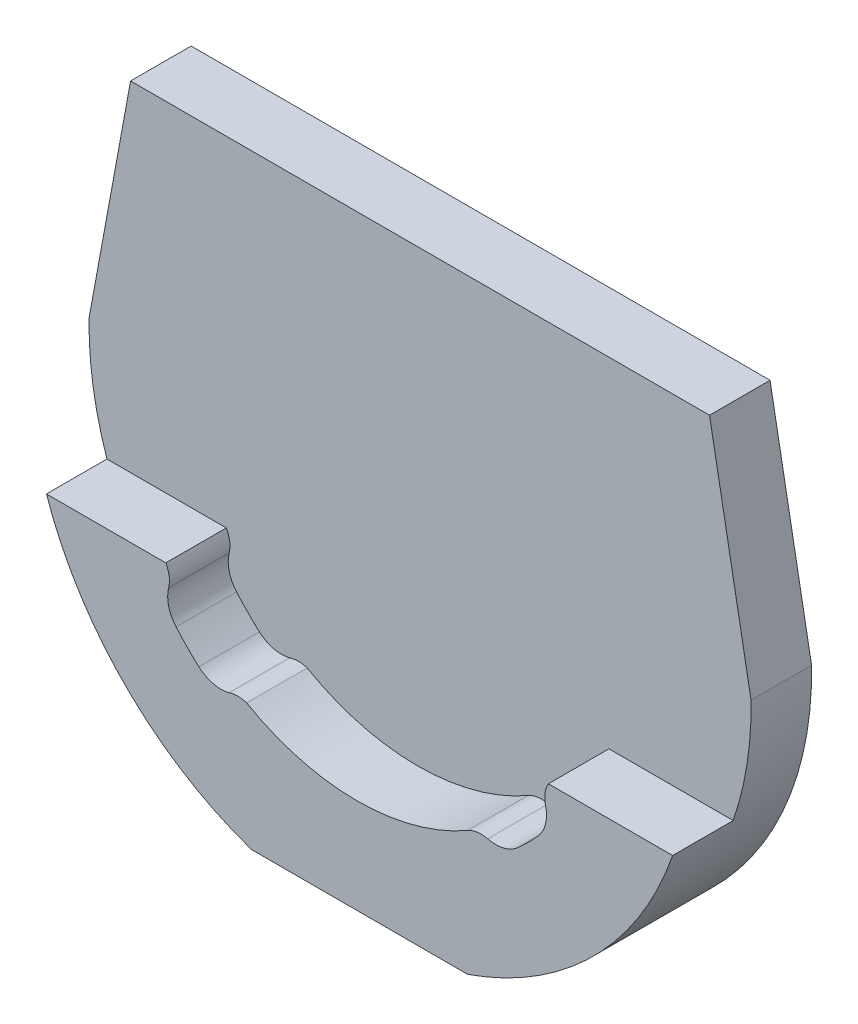
ISO-10303-21;
HEADER;
FILE_DESCRIPTION(('STEP AP214'),'2;1');
FILE_NAME('part.step','',(''),(''),'','','');
FILE_SCHEMA(('AUTOMOTIVE_DESIGN { 1 0 10303 214 1 1 1 1 }'));
ENDSEC;
DATA;
#1=APPLICATION_CONTEXT('core data for automotive mechanical design processes');
#2=APPLICATION_PROTOCOL_DEFINITION('international standard','automotive_design',2000,#1);
#3=PRODUCT_CONTEXT('',#1,'mechanical');
#4=PRODUCT('Part','Part','',(#3));
#5=PRODUCT_RELATED_PRODUCT_CATEGORY('part','',(#4));
#6=PRODUCT_DEFINITION_FORMATION('','',#4);
#7=PRODUCT_DEFINITION_CONTEXT('part definition',#1,'design');
#8=PRODUCT_DEFINITION('design','',#6,#7);
#9=PRODUCT_DEFINITION_SHAPE('','',#8);
#10=(LENGTH_UNIT() NAMED_UNIT(*) SI_UNIT(.MILLI.,.METRE.));
#11=(NAMED_UNIT(*) PLANE_ANGLE_UNIT() SI_UNIT($,.RADIAN.));
#12=(NAMED_UNIT(*) SI_UNIT($,.STERADIAN.) SOLID_ANGLE_UNIT());
#13=UNCERTAINTY_MEASURE_WITH_UNIT(LENGTH_MEASURE(1.E-05),#10,'distance_accuracy_value','');
#14=(GEOMETRIC_REPRESENTATION_CONTEXT(3) GLOBAL_UNCERTAINTY_ASSIGNED_CONTEXT((#13)) GLOBAL_UNIT_ASSIGNED_CONTEXT((#10,
#11,#12)) REPRESENTATION_CONTEXT('',''));
#15=CARTESIAN_POINT('',(0.,0.,0.));
#16=DIRECTION('',(0.,0.,1.));
#17=DIRECTION('',(1.,0.,0.));
#18=AXIS2_PLACEMENT_3D('',#15,#16,#17);
#19=CARTESIAN_POINT('',(0.,0.,10.));
#20=DIRECTION('',(0.,0.,1.));
#21=DIRECTION('',(1.,0.,0.));
#22=AXIS2_PLACEMENT_3D('',#19,#20,#21);
#23=PLANE('',#22);
#24=CARTESIAN_POINT('',(35.5296275291424,-74.0020685087198,10.));
#25=DIRECTION('',(0.,0.,1.));
#26=DIRECTION('',(1.,0.,0.));
#27=AXIS2_PLACEMENT_3D('',#24,#25,#26);
#28=CIRCLE('',#27,4.4999999999999);
#29=CARTESIAN_POINT('',(31.6325132121125,-71.7520685087199,10.));
#30=VERTEX_POINT('',#29);
#31=CARTESIAN_POINT('',(31.1615971727164,-75.0838775516383,10.));
#32=VERTEX_POINT('',#31);
#33=EDGE_CURVE('E63',#30,#32,#28,.T.);
#34=ORIENTED_EDGE('',*,*,#33,.F.);
#35=DIRECTION('',(1.,0.,0.));
#36=VECTOR('',#35,1.);
#37=CARTESIAN_POINT('',(0.,-71.7520685087199,10.));
#38=LINE('',#37,#36);
#39=CARTESIAN_POINT('',(52.1647802977796,-71.7520685087199,10.));
#40=VERTEX_POINT('',#39);
#41=EDGE_CURVE('E292',#30,#40,#38,.T.);
#42=ORIENTED_EDGE('',*,*,#41,.T.);
#43=CARTESIAN_POINT('',(0.426564885495641,-53.9968702290062,10.));
#44=DIRECTION('',(0.,0.,1.));
#45=DIRECTION('',(1.,0.,0.));
#46=AXIS2_PLACEMENT_3D('',#43,#44,#45);
#47=CIRCLE('',#46,54.6999999999986);
#48=CARTESIAN_POINT('',(55.1182089184335,-53.0407985924353,10.));
#49=VERTEX_POINT('',#48);
#50=EDGE_CURVE('E370',#40,#49,#47,.T.);
#51=ORIENTED_EDGE('',*,*,#50,.T.);
#52=DIRECTION('',(0.180616215744238,-0.983553650092475,0.));
#53=VECTOR('',#52,1.);
#54=CARTESIAN_POINT('',(43.8976589010483,8.06120645273723,10.));
#55=LINE('',#54,#53);
#56=CARTESIAN_POINT('',(48.2605057098769,-15.6968702290048,10.));
#57=VERTEX_POINT('',#56);
#58=EDGE_CURVE('E375',#57,#49,#55,.T.);
#59=ORIENTED_EDGE('',*,*,#58,.F.);
#60=DIRECTION('',(1.,0.,0.));
#61=VECTOR('',#60,1.);
#62=CARTESIAN_POINT('',(90.4457835653329,-15.6968702290048,10.));
#63=LINE('',#62,#61);
#64=CARTESIAN_POINT('',(-47.4073759388852,-15.6968702290048,10.));
#65=VERTEX_POINT('',#64);
#66=EDGE_CURVE('E195',#65,#57,#63,.T.);
#67=ORIENTED_EDGE('',*,*,#66,.F.);
#68=DIRECTION('',(-0.180616215744248,-0.983553650092473,0.));
#69=VECTOR('',#68,1.);
#70=CARTESIAN_POINT('',(-43.0723601149073,7.90965158473723,10.));
#71=LINE('',#70,#69);
#72=CARTESIAN_POINT('',(-54.2650791474422,-53.0407985924353,10.));
#73=VERTEX_POINT('',#72);
#74=EDGE_CURVE('E367',#65,#73,#71,.T.);
#75=ORIENTED_EDGE('',*,*,#74,.T.);
#76=CARTESIAN_POINT('',(-51.3116505267882,-71.7520685087201,10.));
#77=VERTEX_POINT('',#76);
#78=EDGE_CURVE('E372',#73,#77,#47,.T.);
#79=ORIENTED_EDGE('',*,*,#78,.T.);
#80=DIRECTION('',(-1.,0.,0.));
#81=VECTOR('',#80,1.);
#82=CARTESIAN_POINT('',(0.,-71.7520685087201,10.));
#83=LINE('',#82,#81);
#84=CARTESIAN_POINT('',(-31.5873412641517,-71.7520685087201,10.));
#85=VERTEX_POINT('',#84);
#86=EDGE_CURVE('E288',#85,#77,#83,.T.);
#87=ORIENTED_EDGE('',*,*,#86,.F.);
#88=CARTESIAN_POINT('',(-35.4844555811817,-74.0020685087201,10.));
#89=DIRECTION('',(0.,0.,1.));
#90=DIRECTION('',(1.,0.,0.));
#91=AXIS2_PLACEMENT_3D('',#88,#89,#90);
#92=CIRCLE('',#91,4.5);
#93=CARTESIAN_POINT('',(-31.1164252247556,-75.0838775516385,10.));
#94=VERTEX_POINT('',#93);
#95=EDGE_CURVE('E284',#94,#85,#92,.T.);
#96=ORIENTED_EDGE('',*,*,#95,.F.);
#97=CARTESIAN_POINT('',(-25.7777214557904,-76.4060886040945,10.));
#98=DIRECTION('',(0.,0.,1.));
#99=DIRECTION('',(1.,0.,0.));
#100=AXIS2_PLACEMENT_3D('',#97,#98,#99);
#101=CIRCLE('',#100,5.50000000000001);
#102=CARTESIAN_POINT('',(-29.8908139445944,-80.0574541265455,10.));
#103=VERTEX_POINT('',#102);
#104=EDGE_CURVE('E281',#94,#103,#101,.T.);
#105=ORIENTED_EDGE('',*,*,#104,.T.);
#106=CARTESIAN_POINT('',(0.426564885495641,-53.9968702290062,10.));
#107=DIRECTION('',(0.,0.,1.));
#108=DIRECTION('',(1.,0.,0.));
#109=AXIS2_PLACEMENT_3D('',#106,#107,#108);
#110=CIRCLE('',#109,39.9787129883877);
#111=CARTESIAN_POINT('',(-26.1146886122792,-83.8943509752954,10.));
#112=VERTEX_POINT('',#111);
#113=EDGE_CURVE('E278',#103,#112,#110,.T.);
#114=ORIENTED_EDGE('',*,*,#113,.T.);
#115=CARTESIAN_POINT('',(-22.4633230898282,-79.7812584864914,10.));
#116=DIRECTION('',(0.,0.,1.));
#117=DIRECTION('',(1.,0.,0.));
#118=AXIS2_PLACEMENT_3D('',#115,#116,#117);
#119=CIRCLE('',#118,5.5);
#120=CARTESIAN_POINT('',(-21.1411120373722,-85.1199622554566,10.));
#121=VERTEX_POINT('',#120);
#122=EDGE_CURVE('E275',#112,#121,#119,.T.);
#123=ORIENTED_EDGE('',*,*,#122,.T.);
#124=CARTESIAN_POINT('',(-19.6726219932029,-89.373612098847,10.));
#125=DIRECTION('',(0.,0.,1.));
#126=DIRECTION('',(1.,0.,0.));
#127=AXIS2_PLACEMENT_3D('',#124,#125,#126);
#128=CIRCLE('',#127,4.49999999999997);
#129=CARTESIAN_POINT('',(-18.2274140260196,-85.1119957468522,10.));
#130=VERTEX_POINT('',#129);
#131=EDGE_CURVE('E272',#130,#121,#128,.T.);
#132=ORIENTED_EDGE('',*,*,#131,.F.);
#133=CARTESIAN_POINT('',(0.0225859739802981,-53.50206850872,10.));
#134=DIRECTION('',(0.,0.,1.));
#135=DIRECTION('',(1.,0.,0.));
#136=AXIS2_PLACEMENT_3D('',#133,#134,#135);
#137=CIRCLE('',#136,36.5000000000001);
#138=CARTESIAN_POINT('',(18.2725859739805,-85.111995746852,10.));
#139=VERTEX_POINT('',#138);
#140=EDGE_CURVE('E191',#130,#139,#137,.T.);
#141=ORIENTED_EDGE('',*,*,#140,.T.);
#142=CARTESIAN_POINT('',(20.5225859739804,-89.0091100638818,10.));
#143=DIRECTION('',(0.,0.,1.));
#144=DIRECTION('',(1.,0.,0.));
#145=AXIS2_PLACEMENT_3D('',#142,#143,#144);
#146=CIRCLE('',#145,4.49999999999983);
#147=CARTESIAN_POINT('',(21.6043950168989,-84.6410797074559,10.));
#148=VERTEX_POINT('',#147);
#149=EDGE_CURVE('E214',#148,#139,#146,.T.);
#150=ORIENTED_EDGE('',*,*,#149,.F.);
#151=CARTESIAN_POINT('',(22.9266060693549,-79.3023759384906,10.));
#152=DIRECTION('',(0.,0.,1.));
#153=DIRECTION('',(1.,0.,0.));
#154=AXIS2_PLACEMENT_3D('',#151,#152,#153);
#155=CIRCLE('',#154,5.50000000000012);
#156=CARTESIAN_POINT('',(26.577971591806,-83.4154684272947,10.));
#157=VERTEX_POINT('',#156);
#158=EDGE_CURVE('E218',#148,#157,#155,.T.);
#159=ORIENTED_EDGE('',*,*,#158,.T.);
#160=CARTESIAN_POINT('',(0.0225859739803214,-53.50206850872,10.));
#161=DIRECTION('',(0.,0.,1.));
#162=DIRECTION('',(1.,0.,0.));
#163=AXIS2_PLACEMENT_3D('',#160,#161,#162);
#164=CIRCLE('',#163,40.0000000000001);
#165=CARTESIAN_POINT('',(29.9359858925553,-80.0574541265454,10.));
#166=VERTEX_POINT('',#165);
#167=EDGE_CURVE('E299',#157,#166,#164,.T.);
#168=ORIENTED_EDGE('',*,*,#167,.T.);
#169=CARTESIAN_POINT('',(25.8228934037512,-76.4060886040943,10.));
#170=DIRECTION('',(0.,0.,1.));
#171=DIRECTION('',(1.,0.,0.));
#172=AXIS2_PLACEMENT_3D('',#169,#170,#171);
#173=CIRCLE('',#172,5.50000000000009);
#174=EDGE_CURVE('E68',#166,#32,#173,.T.);
#175=ORIENTED_EDGE('',*,*,#174,.T.);
#176=EDGE_LOOP('',(#34,#42,#51,#59,#67,#75,#79,#87,#96,#105,#114,#123,#132,#141,#150,#159,#168,#175));
#177=FACE_BOUND('',#176,.T.);
#178=ADVANCED_FACE('F47',(#177),#23,.T.);
#179=CARTESIAN_POINT('',(0.426564885495641,-53.9968702290062,10.));
#180=DIRECTION('',(0.,0.,-1.));
#181=DIRECTION('',(-1.,0.,0.));
#182=AXIS2_PLACEMENT_3D('',#179,#180,#181);
#183=CYLINDRICAL_SURFACE('',#182,54.6999999999986);
#184=ORIENTED_EDGE('',*,*,#50,.F.);
#185=DIRECTION('',(0.,0.,-1.));
#186=VECTOR('',#185,1.);
#187=CARTESIAN_POINT('',(52.1647802977796,-71.7520685087199,20.));
#188=LINE('',#187,#186);
#189=CARTESIAN_POINT('',(52.1647802977796,-71.7520685087199,20.));
#190=VERTEX_POINT('',#189);
#191=EDGE_CURVE('E324',#190,#40,#188,.T.);
#192=ORIENTED_EDGE('',*,*,#191,.F.);
#193=CARTESIAN_POINT('',(0.426564885495641,-53.9968702290062,20.));
#194=DIRECTION('',(0.,0.,1.));
#195=DIRECTION('',(1.,0.,0.));
#196=AXIS2_PLACEMENT_3D('',#193,#194,#195);
#197=CIRCLE('',#196,54.6999999999986);
#198=CARTESIAN_POINT('',(18.2927340327973,-105.696870229005,20.));
#199=VERTEX_POINT('',#198);
#200=EDGE_CURVE('E245',#199,#190,#197,.T.);
#201=ORIENTED_EDGE('',*,*,#200,.F.);
#202=DIRECTION('',(0.,0.,-1.));
#203=VECTOR('',#202,1.);
#204=CARTESIAN_POINT('',(18.2927340327973,-105.696870229005,10.));
#205=LINE('',#204,#203);
#206=CARTESIAN_POINT('',(18.2927340327973,-105.696870229005,0.));
#207=VERTEX_POINT('',#206);
#208=EDGE_CURVE('E362',#199,#207,#205,.T.);
#209=ORIENTED_EDGE('',*,*,#208,.T.);
#210=CARTESIAN_POINT('',(0.426564885495641,-53.9968702290062,0.));
#211=DIRECTION('',(0.,0.,1.));
#212=DIRECTION('',(1.,0.,0.));
#213=AXIS2_PLACEMENT_3D('',#210,#211,#212);
#214=CIRCLE('',#213,54.6999999999986);
#215=CARTESIAN_POINT('',(55.1182089184335,-53.0407985924353,0.));
#216=VERTEX_POINT('',#215);
#217=EDGE_CURVE('E382',#207,#216,#214,.T.);
#218=ORIENTED_EDGE('',*,*,#217,.T.);
#219=DIRECTION('',(0.,0.,-1.));
#220=VECTOR('',#219,1.);
#221=CARTESIAN_POINT('',(55.1182089184335,-53.0407985924353,10.));
#222=LINE('',#221,#220);
#223=EDGE_CURVE('E379',#49,#216,#222,.T.);
#224=ORIENTED_EDGE('',*,*,#223,.F.);
#225=EDGE_LOOP('',(#184,#192,#201,#209,#218,#224));
#226=FACE_BOUND('',#225,.T.);
#227=ADVANCED_FACE('F420',(#226),#183,.T.);
#228=CARTESIAN_POINT('',(-43.0723601149073,7.90965158473723,10.));
#229=DIRECTION('',(0.983553650092473,-0.180616215744248,0.));
#230=DIRECTION('',(0.180616215744248,0.983553650092473,0.));
#231=AXIS2_PLACEMENT_3D('',#228,#229,#230);
#232=PLANE('',#231);
#233=ORIENTED_EDGE('',*,*,#74,.F.);
#234=DIRECTION('',(0.,0.,-1.));
#235=VECTOR('',#234,1.);
#236=CARTESIAN_POINT('',(-47.4073759388852,-15.6968702290048,10.));
#237=LINE('',#236,#235);
#238=CARTESIAN_POINT('',(-47.4073759388852,-15.6968702290048,0.));
#239=VERTEX_POINT('',#238);
#240=EDGE_CURVE('E355',#65,#239,#237,.T.);
#241=ORIENTED_EDGE('',*,*,#240,.T.);
#242=DIRECTION('',(-0.180616215744248,-0.983553650092473,0.));
#243=VECTOR('',#242,1.);
#244=CARTESIAN_POINT('',(-43.0723601149073,7.90965158473723,0.));
#245=LINE('',#244,#243);
#246=CARTESIAN_POINT('',(-54.2650791474422,-53.0407985924353,0.));
#247=VERTEX_POINT('',#246);
#248=EDGE_CURVE('E366',#239,#247,#245,.T.);
#249=ORIENTED_EDGE('',*,*,#248,.T.);
#250=DIRECTION('',(0.,0.,-1.));
#251=VECTOR('',#250,1.);
#252=CARTESIAN_POINT('',(-54.2650791474422,-53.0407985924353,10.));
#253=LINE('',#252,#251);
#254=EDGE_CURVE('E392',#73,#247,#253,.T.);
#255=ORIENTED_EDGE('',*,*,#254,.F.);
#256=EDGE_LOOP('',(#233,#241,#249,#255));
#257=FACE_BOUND('',#256,.T.);
#258=ADVANCED_FACE('F49',(#257),#232,.F.);
#259=CARTESIAN_POINT('',(-17.439604261806,-105.696870229005,0.));
#260=VERTEX_POINT('',#259);
#261=EDGE_CURVE('E383',#247,#260,#214,.T.);
#262=ORIENTED_EDGE('',*,*,#261,.T.);
#263=DIRECTION('',(0.,0.,-1.));
#264=VECTOR('',#263,1.);
#265=CARTESIAN_POINT('',(-17.439604261806,-105.696870229005,10.));
#266=LINE('',#265,#264);
#267=CARTESIAN_POINT('',(-17.439604261806,-105.696870229005,20.));
#268=VERTEX_POINT('',#267);
#269=EDGE_CURVE('E359',#260,#268,#266,.F.);
#270=ORIENTED_EDGE('',*,*,#269,.T.);
#271=CARTESIAN_POINT('',(0.426564885495641,-53.9968702290062,20.));
#272=DIRECTION('',(0.,0.,1.));
#273=DIRECTION('',(1.,0.,0.));
#274=AXIS2_PLACEMENT_3D('',#271,#272,#273);
#275=CIRCLE('',#274,54.6999999999986);
#276=CARTESIAN_POINT('',(-51.3116505267882,-71.7520685087201,20.));
#277=VERTEX_POINT('',#276);
#278=EDGE_CURVE('E237',#277,#268,#275,.T.);
#279=ORIENTED_EDGE('',*,*,#278,.F.);
#280=DIRECTION('',(0.,0.,-1.));
#281=VECTOR('',#280,1.);
#282=CARTESIAN_POINT('',(-51.3116505267882,-71.7520685087201,20.));
#283=LINE('',#282,#281);
#284=EDGE_CURVE('E328',#277,#77,#283,.T.);
#285=ORIENTED_EDGE('',*,*,#284,.T.);
#286=ORIENTED_EDGE('',*,*,#78,.F.);
#287=ORIENTED_EDGE('',*,*,#254,.T.);
#288=EDGE_LOOP('',(#262,#270,#279,#285,#286,#287));
#289=FACE_BOUND('',#288,.T.);
#290=ADVANCED_FACE('F405',(#289),#183,.T.);
#291=CARTESIAN_POINT('',(43.8976589010483,8.06120645273723,10.));
#292=DIRECTION('',(0.983553650092475,0.180616215744238,0.));
#293=DIRECTION('',(-0.180616215744238,0.983553650092475,0.));
#294=AXIS2_PLACEMENT_3D('',#291,#292,#293);
#295=PLANE('',#294);
#296=DIRECTION('',(0.,0.,-1.));
#297=VECTOR('',#296,1.);
#298=CARTESIAN_POINT('',(48.2605057098769,-15.6968702290048,10.));
#299=LINE('',#298,#297);
#300=CARTESIAN_POINT('',(48.2605057098769,-15.6968702290048,0.));
#301=VERTEX_POINT('',#300);
#302=EDGE_CURVE('E352',#57,#301,#299,.T.);
#303=ORIENTED_EDGE('',*,*,#302,.F.);
#304=ORIENTED_EDGE('',*,*,#58,.T.);
#305=ORIENTED_EDGE('',*,*,#223,.T.);
#306=DIRECTION('',(0.180616215744238,-0.983553650092475,0.));
#307=VECTOR('',#306,1.);
#308=CARTESIAN_POINT('',(43.8976589010483,8.06120645273723,0.));
#309=LINE('',#308,#307);
#310=EDGE_CURVE('E371',#301,#216,#309,.T.);
#311=ORIENTED_EDGE('',*,*,#310,.F.);
#312=EDGE_LOOP('',(#303,#304,#305,#311));
#313=FACE_BOUND('',#312,.T.);
#314=ADVANCED_FACE('F415',(#313),#295,.T.);
#315=CARTESIAN_POINT('',(0.,0.,0.));
#316=DIRECTION('',(0.,0.,1.));
#317=DIRECTION('',(1.,0.,0.));
#318=AXIS2_PLACEMENT_3D('',#315,#316,#317);
#319=PLANE('',#318);
#320=ORIENTED_EDGE('',*,*,#248,.F.);
#321=DIRECTION('',(1.,0.,0.));
#322=VECTOR('',#321,1.);
#323=CARTESIAN_POINT('',(0.,-15.6968702290048,0.));
#324=LINE('',#323,#322);
#325=EDGE_CURVE('E11',#239,#301,#324,.T.);
#326=ORIENTED_EDGE('',*,*,#325,.T.);
#327=ORIENTED_EDGE('',*,*,#310,.T.);
#328=ORIENTED_EDGE('',*,*,#217,.F.);
#329=DIRECTION('',(-1.,0.,0.));
#330=VECTOR('',#329,1.);
#331=CARTESIAN_POINT('',(0.,-105.696870229005,0.));
#332=LINE('',#331,#330);
#333=EDGE_CURVE('E56',#207,#260,#332,.T.);
#334=ORIENTED_EDGE('',*,*,#333,.T.);
#335=ORIENTED_EDGE('',*,*,#261,.F.);
#336=EDGE_LOOP('',(#320,#326,#327,#328,#334,#335));
#337=FACE_BOUND('',#336,.T.);
#338=ADVANCED_FACE('F401',(#337),#319,.F.);
#339=CARTESIAN_POINT('',(-70.8533033976946,-105.696870229005,0.));
#340=DIRECTION('',(0.,1.,0.));
#341=DIRECTION('',(0.,0.,1.));
#342=AXIS2_PLACEMENT_3D('',#339,#340,#341);
#343=PLANE('',#342);
#344=ORIENTED_EDGE('',*,*,#208,.F.);
#345=DIRECTION('',(1.,0.,0.));
#346=VECTOR('',#345,1.);
#347=CARTESIAN_POINT('',(0.,-105.696870229005,20.));
#348=LINE('',#347,#346);
#349=EDGE_CURVE('E241',#268,#199,#348,.T.);
#350=ORIENTED_EDGE('',*,*,#349,.F.);
#351=ORIENTED_EDGE('',*,*,#269,.F.);
#352=ORIENTED_EDGE('',*,*,#333,.F.);
#353=EDGE_LOOP('',(#344,#350,#351,#352));
#354=FACE_BOUND('',#353,.T.);
#355=ADVANCED_FACE('F432',(#354),#343,.F.);
#356=CARTESIAN_POINT('',(90.4457835653329,-15.6968702290048,0.));
#357=DIRECTION('',(0.,-1.,0.));
#358=DIRECTION('',(0.,0.,-1.));
#359=AXIS2_PLACEMENT_3D('',#356,#357,#358);
#360=PLANE('',#359);
#361=ORIENTED_EDGE('',*,*,#66,.T.);
#362=ORIENTED_EDGE('',*,*,#302,.T.);
#363=ORIENTED_EDGE('',*,*,#325,.F.);
#364=ORIENTED_EDGE('',*,*,#240,.F.);
#365=EDGE_LOOP('',(#361,#362,#363,#364));
#366=FACE_BOUND('',#365,.T.);
#367=ADVANCED_FACE('F434',(#366),#360,.F.);
#368=CARTESIAN_POINT('',(0.0225859739802981,-53.50206850872,20.));
#369=DIRECTION('',(0.,0.,-1.));
#370=DIRECTION('',(-1.,0.,0.));
#371=AXIS2_PLACEMENT_3D('',#368,#369,#370);
#372=CYLINDRICAL_SURFACE('',#371,36.5000000000001);
#373=ORIENTED_EDGE('',*,*,#140,.F.);
#374=DIRECTION('',(0.,0.,-1.));
#375=VECTOR('',#374,1.);
#376=CARTESIAN_POINT('',(-18.2274140260196,-85.1119957468522,20.));
#377=LINE('',#376,#375);
#378=CARTESIAN_POINT('',(-18.2274140260196,-85.1119957468522,20.));
#379=VERTEX_POINT('',#378);
#380=EDGE_CURVE('E185',#379,#130,#377,.T.);
#381=ORIENTED_EDGE('',*,*,#380,.F.);
#382=CARTESIAN_POINT('',(0.0225859739802981,-53.50206850872,20.));
#383=DIRECTION('',(0.,0.,1.));
#384=DIRECTION('',(1.,0.,0.));
#385=AXIS2_PLACEMENT_3D('',#382,#383,#384);
#386=CIRCLE('',#385,36.5000000000001);
#387=CARTESIAN_POINT('',(18.2725859739805,-85.111995746852,20.));
#388=VERTEX_POINT('',#387);
#389=EDGE_CURVE('E190',#379,#388,#386,.T.);
#390=ORIENTED_EDGE('',*,*,#389,.T.);
#391=DIRECTION('',(0.,0.,-1.));
#392=VECTOR('',#391,1.);
#393=CARTESIAN_POINT('',(18.2725859739805,-85.111995746852,20.));
#394=LINE('',#393,#392);
#395=EDGE_CURVE('E269',#388,#139,#394,.T.);
#396=ORIENTED_EDGE('',*,*,#395,.T.);
#397=EDGE_LOOP('',(#373,#381,#390,#396));
#398=FACE_BOUND('',#397,.T.);
#399=ADVANCED_FACE('F187',(#398),#372,.F.);
#400=CARTESIAN_POINT('',(-19.6726219932029,-89.373612098847,20.));
#401=DIRECTION('',(0.,0.,-1.));
#402=DIRECTION('',(-1.,0.,0.));
#403=AXIS2_PLACEMENT_3D('',#400,#401,#402);
#404=CYLINDRICAL_SURFACE('',#403,4.49999999999997);
#405=ORIENTED_EDGE('',*,*,#131,.T.);
#406=DIRECTION('',(0.,0.,-1.));
#407=VECTOR('',#406,1.);
#408=CARTESIAN_POINT('',(-21.1411120373722,-85.1199622554566,20.));
#409=LINE('',#408,#407);
#410=CARTESIAN_POINT('',(-21.1411120373722,-85.1199622554566,20.));
#411=VERTEX_POINT('',#410);
#412=EDGE_CURVE('E196',#411,#121,#409,.T.);
#413=ORIENTED_EDGE('',*,*,#412,.F.);
#414=CARTESIAN_POINT('',(-19.6726219932029,-89.373612098847,20.));
#415=DIRECTION('',(0.,0.,1.));
#416=DIRECTION('',(1.,0.,0.));
#417=AXIS2_PLACEMENT_3D('',#414,#415,#416);
#418=CIRCLE('',#417,4.49999999999997);
#419=EDGE_CURVE('E199',#379,#411,#418,.T.);
#420=ORIENTED_EDGE('',*,*,#419,.F.);
#421=ORIENTED_EDGE('',*,*,#380,.T.);
#422=EDGE_LOOP('',(#405,#413,#420,#421));
#423=FACE_BOUND('',#422,.T.);
#424=ADVANCED_FACE('F200',(#423),#404,.T.);
#425=CARTESIAN_POINT('',(-22.4633230898282,-79.7812584864914,20.));
#426=DIRECTION('',(0.,0.,-1.));
#427=DIRECTION('',(-1.,0.,0.));
#428=AXIS2_PLACEMENT_3D('',#425,#426,#427);
#429=CYLINDRICAL_SURFACE('',#428,5.5);
#430=ORIENTED_EDGE('',*,*,#122,.F.);
#431=DIRECTION('',(0.,0.,-1.));
#432=VECTOR('',#431,1.);
#433=CARTESIAN_POINT('',(-26.1146886122792,-83.8943509752954,20.));
#434=LINE('',#433,#432);
#435=CARTESIAN_POINT('',(-26.1146886122792,-83.8943509752954,20.));
#436=VERTEX_POINT('',#435);
#437=EDGE_CURVE('E344',#436,#112,#434,.T.);
#438=ORIENTED_EDGE('',*,*,#437,.F.);
#439=CARTESIAN_POINT('',(-22.4633230898282,-79.7812584864914,20.));
#440=DIRECTION('',(0.,0.,1.));
#441=DIRECTION('',(1.,0.,0.));
#442=AXIS2_PLACEMENT_3D('',#439,#440,#441);
#443=CIRCLE('',#442,5.5);
#444=EDGE_CURVE('E206',#436,#411,#443,.T.);
#445=ORIENTED_EDGE('',*,*,#444,.T.);
#446=ORIENTED_EDGE('',*,*,#412,.T.);
#447=EDGE_LOOP('',(#430,#438,#445,#446));
#448=FACE_BOUND('',#447,.T.);
#449=ADVANCED_FACE('F524',(#448),#429,.F.);
#450=CARTESIAN_POINT('',(0.426564885495641,-53.9968702290062,20.));
#451=DIRECTION('',(0.,0.,-1.));
#452=DIRECTION('',(-1.,0.,0.));
#453=AXIS2_PLACEMENT_3D('',#450,#451,#452);
#454=CYLINDRICAL_SURFACE('',#453,39.9787129883877);
#455=ORIENTED_EDGE('',*,*,#113,.F.);
#456=DIRECTION('',(0.,0.,-1.));
#457=VECTOR('',#456,1.);
#458=CARTESIAN_POINT('',(-29.8908139445944,-80.0574541265455,20.));
#459=LINE('',#458,#457);
#460=CARTESIAN_POINT('',(-29.8908139445944,-80.0574541265455,20.));
#461=VERTEX_POINT('',#460);
#462=EDGE_CURVE('E340',#461,#103,#459,.T.);
#463=ORIENTED_EDGE('',*,*,#462,.F.);
#464=CARTESIAN_POINT('',(0.426564885495641,-53.9968702290062,20.));
#465=DIRECTION('',(0.,0.,1.));
#466=DIRECTION('',(1.,0.,0.));
#467=AXIS2_PLACEMENT_3D('',#464,#465,#466);
#468=CIRCLE('',#467,39.9787129883877);
#469=EDGE_CURVE('E223',#461,#436,#468,.T.);
#470=ORIENTED_EDGE('',*,*,#469,.T.);
#471=ORIENTED_EDGE('',*,*,#437,.T.);
#472=EDGE_LOOP('',(#455,#463,#470,#471));
#473=FACE_BOUND('',#472,.T.);
#474=ADVANCED_FACE('F533',(#473),#454,.F.);
#475=CARTESIAN_POINT('',(-25.7777214557904,-76.4060886040945,20.));
#476=DIRECTION('',(0.,0.,-1.));
#477=DIRECTION('',(-1.,0.,0.));
#478=AXIS2_PLACEMENT_3D('',#475,#476,#477);
#479=CYLINDRICAL_SURFACE('',#478,5.50000000000001);
#480=ORIENTED_EDGE('',*,*,#104,.F.);
#481=DIRECTION('',(0.,0.,-1.));
#482=VECTOR('',#481,1.);
#483=CARTESIAN_POINT('',(-31.1164252247556,-75.0838775516385,20.));
#484=LINE('',#483,#482);
#485=CARTESIAN_POINT('',(-31.1164252247556,-75.0838775516385,20.));
#486=VERTEX_POINT('',#485);
#487=EDGE_CURVE('E336',#486,#94,#484,.T.);
#488=ORIENTED_EDGE('',*,*,#487,.F.);
#489=CARTESIAN_POINT('',(-25.7777214557904,-76.4060886040945,20.));
#490=DIRECTION('',(0.,0.,1.));
#491=DIRECTION('',(1.,0.,0.));
#492=AXIS2_PLACEMENT_3D('',#489,#490,#491);
#493=CIRCLE('',#492,5.50000000000001);
#494=EDGE_CURVE('E227',#486,#461,#493,.T.);
#495=ORIENTED_EDGE('',*,*,#494,.T.);
#496=ORIENTED_EDGE('',*,*,#462,.T.);
#497=EDGE_LOOP('',(#480,#488,#495,#496));
#498=FACE_BOUND('',#497,.T.);
#499=ADVANCED_FACE('F543',(#498),#479,.F.);
#500=CARTESIAN_POINT('',(-35.4844555811817,-74.0020685087201,20.));
#501=DIRECTION('',(0.,0.,-1.));
#502=DIRECTION('',(-1.,0.,0.));
#503=AXIS2_PLACEMENT_3D('',#500,#501,#502);
#504=CYLINDRICAL_SURFACE('',#503,4.5);
#505=ORIENTED_EDGE('',*,*,#95,.T.);
#506=DIRECTION('',(0.,0.,-1.));
#507=VECTOR('',#506,1.);
#508=CARTESIAN_POINT('',(-31.5873412641517,-71.7520685087201,20.));
#509=LINE('',#508,#507);
#510=CARTESIAN_POINT('',(-31.5873412641517,-71.7520685087201,20.));
#511=VERTEX_POINT('',#510);
#512=EDGE_CURVE('E332',#511,#85,#509,.T.);
#513=ORIENTED_EDGE('',*,*,#512,.F.);
#514=CARTESIAN_POINT('',(-35.4844555811817,-74.0020685087201,20.));
#515=DIRECTION('',(0.,0.,1.));
#516=DIRECTION('',(1.,0.,0.));
#517=AXIS2_PLACEMENT_3D('',#514,#515,#516);
#518=CIRCLE('',#517,4.5);
#519=EDGE_CURVE('E231',#486,#511,#518,.T.);
#520=ORIENTED_EDGE('',*,*,#519,.F.);
#521=ORIENTED_EDGE('',*,*,#487,.T.);
#522=EDGE_LOOP('',(#505,#513,#520,#521));
#523=FACE_BOUND('',#522,.T.);
#524=ADVANCED_FACE('F553',(#523),#504,.T.);
#525=CARTESIAN_POINT('',(0.,-71.7520685087201,20.));
#526=DIRECTION('',(0.,-1.,0.));
#527=DIRECTION('',(0.,0.,-1.));
#528=AXIS2_PLACEMENT_3D('',#525,#526,#527);
#529=PLANE('',#528);
#530=ORIENTED_EDGE('',*,*,#86,.T.);
#531=ORIENTED_EDGE('',*,*,#284,.F.);
#532=DIRECTION('',(-1.,0.,0.));
#533=VECTOR('',#532,1.);
#534=CARTESIAN_POINT('',(0.,-71.7520685087201,20.));
#535=LINE('',#534,#533);
#536=EDGE_CURVE('E234',#511,#277,#535,.T.);
#537=ORIENTED_EDGE('',*,*,#536,.F.);
#538=ORIENTED_EDGE('',*,*,#512,.T.);
#539=EDGE_LOOP('',(#530,#531,#537,#538));
#540=FACE_BOUND('',#539,.T.);
#541=ADVANCED_FACE('F563',(#540),#529,.F.);
#542=CARTESIAN_POINT('',(0.,-71.7520685087199,20.));
#543=DIRECTION('',(0.,1.,0.));
#544=DIRECTION('',(0.,0.,1.));
#545=AXIS2_PLACEMENT_3D('',#542,#543,#544);
#546=PLANE('',#545);
#547=ORIENTED_EDGE('',*,*,#41,.F.);
#548=DIRECTION('',(0.,0.,-1.));
#549=VECTOR('',#548,1.);
#550=CARTESIAN_POINT('',(31.6325132121125,-71.7520685087199,20.));
#551=LINE('',#550,#549);
#552=CARTESIAN_POINT('',(31.6325132121125,-71.7520685087199,20.));
#553=VERTEX_POINT('',#552);
#554=EDGE_CURVE('E321',#553,#30,#551,.T.);
#555=ORIENTED_EDGE('',*,*,#554,.F.);
#556=DIRECTION('',(1.,0.,0.));
#557=VECTOR('',#556,1.);
#558=CARTESIAN_POINT('',(0.,-71.7520685087199,20.));
#559=LINE('',#558,#557);
#560=EDGE_CURVE('E248',#553,#190,#559,.T.);
#561=ORIENTED_EDGE('',*,*,#560,.T.);
#562=ORIENTED_EDGE('',*,*,#191,.T.);
#563=EDGE_LOOP('',(#547,#555,#561,#562));
#564=FACE_BOUND('',#563,.T.);
#565=ADVANCED_FACE('F428',(#564),#546,.T.);
#566=CARTESIAN_POINT('',(35.5296275291424,-74.0020685087198,20.));
#567=DIRECTION('',(0.,0.,-1.));
#568=DIRECTION('',(-1.,0.,0.));
#569=AXIS2_PLACEMENT_3D('',#566,#567,#568);
#570=CYLINDRICAL_SURFACE('',#569,4.4999999999999);
#571=ORIENTED_EDGE('',*,*,#33,.T.);
#572=DIRECTION('',(0.,0.,-1.));
#573=VECTOR('',#572,1.);
#574=CARTESIAN_POINT('',(31.1615971727164,-75.0838775516383,20.));
#575=LINE('',#574,#573);
#576=CARTESIAN_POINT('',(31.1615971727164,-75.0838775516383,20.));
#577=VERTEX_POINT('',#576);
#578=EDGE_CURVE('E318',#577,#32,#575,.T.);
#579=ORIENTED_EDGE('',*,*,#578,.F.);
#580=CARTESIAN_POINT('',(35.5296275291424,-74.0020685087198,20.));
#581=DIRECTION('',(0.,0.,1.));
#582=DIRECTION('',(1.,0.,0.));
#583=AXIS2_PLACEMENT_3D('',#580,#581,#582);
#584=CIRCLE('',#583,4.4999999999999);
#585=EDGE_CURVE('E252',#553,#577,#584,.T.);
#586=ORIENTED_EDGE('',*,*,#585,.F.);
#587=ORIENTED_EDGE('',*,*,#554,.T.);
#588=EDGE_LOOP('',(#571,#579,#586,#587));
#589=FACE_BOUND('',#588,.T.);
#590=ADVANCED_FACE('F582',(#589),#570,.T.);
#591=CARTESIAN_POINT('',(25.8228934037512,-76.4060886040943,20.));
#592=DIRECTION('',(0.,0.,-1.));
#593=DIRECTION('',(-1.,0.,0.));
#594=AXIS2_PLACEMENT_3D('',#591,#592,#593);
#595=CYLINDRICAL_SURFACE('',#594,5.50000000000009);
#596=ORIENTED_EDGE('',*,*,#174,.F.);
#597=DIRECTION('',(0.,0.,-1.));
#598=VECTOR('',#597,1.);
#599=CARTESIAN_POINT('',(29.9359858925553,-80.0574541265454,20.));
#600=LINE('',#599,#598);
#601=CARTESIAN_POINT('',(29.9359858925553,-80.0574541265454,20.));
#602=VERTEX_POINT('',#601);
#603=EDGE_CURVE('E314',#602,#166,#600,.T.);
#604=ORIENTED_EDGE('',*,*,#603,.F.);
#605=CARTESIAN_POINT('',(25.8228934037512,-76.4060886040943,20.));
#606=DIRECTION('',(0.,0.,1.));
#607=DIRECTION('',(1.,0.,0.));
#608=AXIS2_PLACEMENT_3D('',#605,#606,#607);
#609=CIRCLE('',#608,5.50000000000009);
#610=EDGE_CURVE('E255',#602,#577,#609,.T.);
#611=ORIENTED_EDGE('',*,*,#610,.T.);
#612=ORIENTED_EDGE('',*,*,#578,.T.);
#613=EDGE_LOOP('',(#596,#604,#611,#612));
#614=FACE_BOUND('',#613,.T.);
#615=ADVANCED_FACE('F591',(#614),#595,.F.);
#616=CARTESIAN_POINT('',(0.0225859739803214,-53.50206850872,20.));
#617=DIRECTION('',(0.,0.,-1.));
#618=DIRECTION('',(-1.,0.,0.));
#619=AXIS2_PLACEMENT_3D('',#616,#617,#618);
#620=CYLINDRICAL_SURFACE('',#619,40.0000000000001);
#621=ORIENTED_EDGE('',*,*,#167,.F.);
#622=DIRECTION('',(0.,0.,-1.));
#623=VECTOR('',#622,1.);
#624=CARTESIAN_POINT('',(26.577971591806,-83.4154684272947,20.));
#625=LINE('',#624,#623);
#626=CARTESIAN_POINT('',(26.577971591806,-83.4154684272947,20.));
#627=VERTEX_POINT('',#626);
#628=EDGE_CURVE('E310',#627,#157,#625,.T.);
#629=ORIENTED_EDGE('',*,*,#628,.F.);
#630=CARTESIAN_POINT('',(0.0225859739803214,-53.50206850872,20.));
#631=DIRECTION('',(0.,0.,1.));
#632=DIRECTION('',(1.,0.,0.));
#633=AXIS2_PLACEMENT_3D('',#630,#631,#632);
#634=CIRCLE('',#633,40.0000000000001);
#635=EDGE_CURVE('E259',#627,#602,#634,.T.);
#636=ORIENTED_EDGE('',*,*,#635,.T.);
#637=ORIENTED_EDGE('',*,*,#603,.T.);
#638=EDGE_LOOP('',(#621,#629,#636,#637));
#639=FACE_BOUND('',#638,.T.);
#640=ADVANCED_FACE('F604',(#639),#620,.F.);
#641=CARTESIAN_POINT('',(22.9266060693549,-79.3023759384906,20.));
#642=DIRECTION('',(0.,0.,-1.));
#643=DIRECTION('',(-1.,0.,0.));
#644=AXIS2_PLACEMENT_3D('',#641,#642,#643);
#645=CYLINDRICAL_SURFACE('',#644,5.50000000000012);
#646=ORIENTED_EDGE('',*,*,#158,.F.);
#647=DIRECTION('',(0.,0.,-1.));
#648=VECTOR('',#647,1.);
#649=CARTESIAN_POINT('',(21.6043950168989,-84.6410797074559,20.));
#650=LINE('',#649,#648);
#651=CARTESIAN_POINT('',(21.6043950168989,-84.6410797074559,20.));
#652=VERTEX_POINT('',#651);
#653=EDGE_CURVE('E306',#652,#148,#650,.T.);
#654=ORIENTED_EDGE('',*,*,#653,.F.);
#655=CARTESIAN_POINT('',(22.9266060693549,-79.3023759384906,20.));
#656=DIRECTION('',(0.,0.,1.));
#657=DIRECTION('',(1.,0.,0.));
#658=AXIS2_PLACEMENT_3D('',#655,#656,#657);
#659=CIRCLE('',#658,5.50000000000012);
#660=EDGE_CURVE('E263',#652,#627,#659,.T.);
#661=ORIENTED_EDGE('',*,*,#660,.T.);
#662=ORIENTED_EDGE('',*,*,#628,.T.);
#663=EDGE_LOOP('',(#646,#654,#661,#662));
#664=FACE_BOUND('',#663,.T.);
#665=ADVANCED_FACE('F617',(#664),#645,.F.);
#666=CARTESIAN_POINT('',(20.5225859739804,-89.0091100638818,20.));
#667=DIRECTION('',(0.,0.,-1.));
#668=DIRECTION('',(-1.,0.,0.));
#669=AXIS2_PLACEMENT_3D('',#666,#667,#668);
#670=CYLINDRICAL_SURFACE('',#669,4.49999999999983);
#671=ORIENTED_EDGE('',*,*,#149,.T.);
#672=ORIENTED_EDGE('',*,*,#395,.F.);
#673=CARTESIAN_POINT('',(20.5225859739804,-89.0091100638818,20.));
#674=DIRECTION('',(0.,0.,1.));
#675=DIRECTION('',(1.,0.,0.));
#676=AXIS2_PLACEMENT_3D('',#673,#674,#675);
#677=CIRCLE('',#676,4.49999999999983);
#678=EDGE_CURVE('E211',#652,#388,#677,.T.);
#679=ORIENTED_EDGE('',*,*,#678,.F.);
#680=ORIENTED_EDGE('',*,*,#653,.T.);
#681=EDGE_LOOP('',(#671,#672,#679,#680));
#682=FACE_BOUND('',#681,.T.);
#683=ADVANCED_FACE('F627',(#682),#670,.T.);
#684=CARTESIAN_POINT('',(0.,0.,20.));
#685=DIRECTION('',(0.,0.,1.));
#686=DIRECTION('',(1.,0.,0.));
#687=AXIS2_PLACEMENT_3D('',#684,#685,#686);
#688=PLANE('',#687);
#689=ORIENTED_EDGE('',*,*,#389,.F.);
#690=ORIENTED_EDGE('',*,*,#419,.T.);
#691=ORIENTED_EDGE('',*,*,#444,.F.);
#692=ORIENTED_EDGE('',*,*,#469,.F.);
#693=ORIENTED_EDGE('',*,*,#494,.F.);
#694=ORIENTED_EDGE('',*,*,#519,.T.);
#695=ORIENTED_EDGE('',*,*,#536,.T.);
#696=ORIENTED_EDGE('',*,*,#278,.T.);
#697=ORIENTED_EDGE('',*,*,#349,.T.);
#698=ORIENTED_EDGE('',*,*,#200,.T.);
#699=ORIENTED_EDGE('',*,*,#560,.F.);
#700=ORIENTED_EDGE('',*,*,#585,.T.);
#701=ORIENTED_EDGE('',*,*,#610,.F.);
#702=ORIENTED_EDGE('',*,*,#635,.F.);
#703=ORIENTED_EDGE('',*,*,#660,.F.);
#704=ORIENTED_EDGE('',*,*,#678,.T.);
#705=EDGE_LOOP('',(#689,#690,#691,#692,#693,#694,#695,#696,#697,#698,#699,#700,#701,#702,#703,#704));
#706=FACE_BOUND('',#705,.T.);
#707=ADVANCED_FACE('F208',(#706),#688,.T.);
#708=CLOSED_SHELL('',(#178,#227,#258,#290,#314,#338,#355,#367,#399,#424,#449,#474,#499,#524,
#541,#565,#590,#615,#640,#665,#683,#707));
#709=MANIFOLD_SOLID_BREP('B2',#708);
#710=ADVANCED_BREP_SHAPE_REPRESENTATION('',(#18,#709),#14);
#711=SHAPE_DEFINITION_REPRESENTATION(#9,#710);
ENDSEC;
END-ISO-10303-21;
